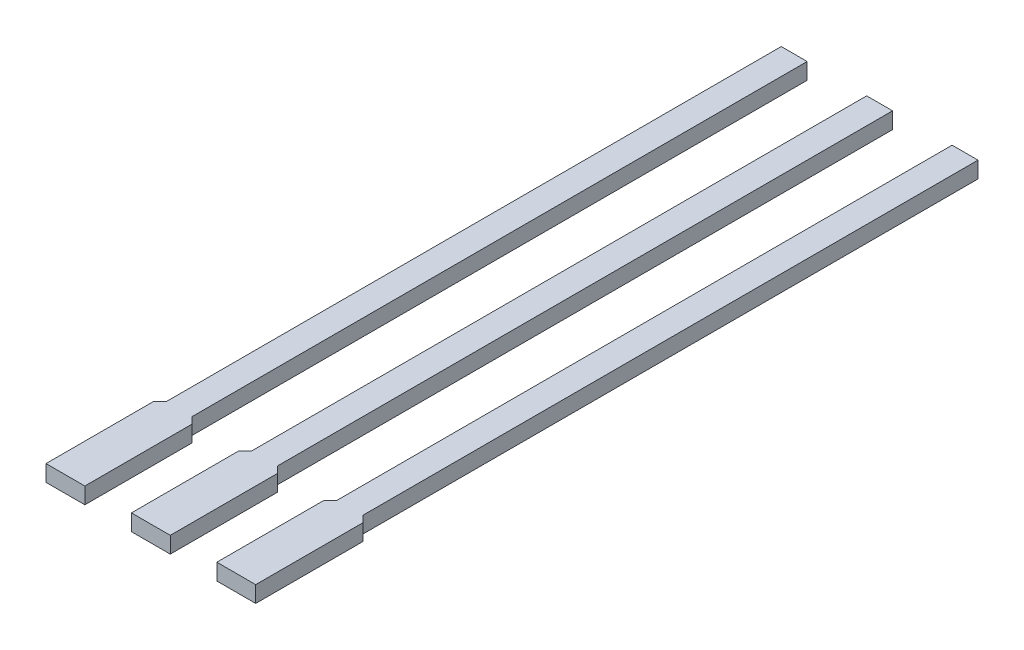
ISO-10303-21;
HEADER;
FILE_DESCRIPTION(('STEP AP214'),'2;1');
FILE_NAME('part.step','',(''),(''),'','','');
FILE_SCHEMA(('AUTOMOTIVE_DESIGN { 1 0 10303 214 1 1 1 1 }'));
ENDSEC;
DATA;
#1=APPLICATION_CONTEXT('core data for automotive mechanical design processes');
#2=APPLICATION_PROTOCOL_DEFINITION('international standard','automotive_design',2000,#1);
#3=PRODUCT_CONTEXT('',#1,'mechanical');
#4=PRODUCT('Part','Part','',(#3));
#5=PRODUCT_RELATED_PRODUCT_CATEGORY('part','',(#4));
#6=PRODUCT_DEFINITION_FORMATION('','',#4);
#7=PRODUCT_DEFINITION_CONTEXT('part definition',#1,'design');
#8=PRODUCT_DEFINITION('design','',#6,#7);
#9=PRODUCT_DEFINITION_SHAPE('','',#8);
#10=(LENGTH_UNIT() NAMED_UNIT(*) SI_UNIT(.MILLI.,.METRE.));
#11=(NAMED_UNIT(*) PLANE_ANGLE_UNIT() SI_UNIT($,.RADIAN.));
#12=(NAMED_UNIT(*) SI_UNIT($,.STERADIAN.) SOLID_ANGLE_UNIT());
#13=UNCERTAINTY_MEASURE_WITH_UNIT(LENGTH_MEASURE(1.E-05),#10,'distance_accuracy_value','');
#14=(GEOMETRIC_REPRESENTATION_CONTEXT(3) GLOBAL_UNCERTAINTY_ASSIGNED_CONTEXT((#13)) GLOBAL_UNIT_ASSIGNED_CONTEXT((#10,
#11,#12)) REPRESENTATION_CONTEXT('',''));
#15=CARTESIAN_POINT('',(0.,0.,0.));
#16=DIRECTION('',(0.,0.,1.));
#17=DIRECTION('',(1.,0.,0.));
#18=AXIS2_PLACEMENT_3D('',#15,#16,#17);
#19=CARTESIAN_POINT('',(0.,-0.2425,-7.336656531165));
#20=DIRECTION('',(0.,-1.,0.));
#21=DIRECTION('',(-1.,0.,0.));
#22=AXIS2_PLACEMENT_3D('',#19,#20,#21);
#23=PLANE('',#22);
#24=DIRECTION('',(1.,0.,0.));
#25=VECTOR('',#24,1.);
#26=CARTESIAN_POINT('',(-0.385,-0.2425,-18.29));
#27=LINE('',#26,#25);
#28=CARTESIAN_POINT('',(-0.385,-0.2425,-18.29));
#29=VERTEX_POINT('',#28);
#30=CARTESIAN_POINT('',(0.385,-0.2425,-18.29));
#31=VERTEX_POINT('',#30);
#32=EDGE_CURVE('P0_E137',#29,#31,#27,.T.);
#33=ORIENTED_EDGE('',*,*,#32,.T.);
#34=DIRECTION('',(0.,0.,1.));
#35=VECTOR('',#34,1.);
#36=CARTESIAN_POINT('',(0.385,-0.2425,-18.29));
#37=LINE('',#36,#35);
#38=CARTESIAN_POINT('',(0.385,-0.2425,0.));
#39=VERTEX_POINT('',#38);
#40=EDGE_CURVE('P0_E157',#31,#39,#37,.T.);
#41=ORIENTED_EDGE('',*,*,#40,.T.);
#42=DIRECTION('',(-0.707106781186548,0.,-0.707106781186548));
#43=VECTOR('',#42,1.);
#44=CARTESIAN_POINT('',(0.1925,-0.2425,-0.1925));
#45=LINE('',#44,#43);
#46=CARTESIAN_POINT('',(0.5775,-0.2425,0.1925));
#47=VERTEX_POINT('',#46);
#48=EDGE_CURVE('P0_E113',#47,#39,#45,.T.);
#49=ORIENTED_EDGE('',*,*,#48,.F.);
#50=DIRECTION('',(0.,0.,1.));
#51=VECTOR('',#50,1.);
#52=CARTESIAN_POINT('',(0.5775,-0.2425,0.));
#53=LINE('',#52,#51);
#54=CARTESIAN_POINT('',(0.5775,-0.2425,3.38));
#55=VERTEX_POINT('',#54);
#56=EDGE_CURVE('P0_E105',#47,#55,#53,.T.);
#57=ORIENTED_EDGE('',*,*,#56,.T.);
#58=DIRECTION('',(1.,0.,0.));
#59=VECTOR('',#58,1.);
#60=CARTESIAN_POINT('',(-0.5775,-0.2425,3.38));
#61=LINE('',#60,#59);
#62=CARTESIAN_POINT('',(-0.5775,-0.2425,3.38));
#63=VERTEX_POINT('',#62);
#64=EDGE_CURVE('P0_E27',#63,#55,#61,.T.);
#65=ORIENTED_EDGE('',*,*,#64,.F.);
#66=DIRECTION('',(0.,0.,1.));
#67=VECTOR('',#66,1.);
#68=CARTESIAN_POINT('',(-0.5775,-0.2425,0.));
#69=LINE('',#68,#67);
#70=CARTESIAN_POINT('',(-0.5775,-0.2425,0.1925));
#71=VERTEX_POINT('',#70);
#72=EDGE_CURVE('P0_E175',#71,#63,#69,.T.);
#73=ORIENTED_EDGE('',*,*,#72,.F.);
#74=DIRECTION('',(0.707106781186548,0.,-0.707106781186548));
#75=VECTOR('',#74,1.);
#76=CARTESIAN_POINT('',(-0.48125,-0.2425,0.09625));
#77=LINE('',#76,#75);
#78=CARTESIAN_POINT('',(-0.385,-0.2425,0.));
#79=VERTEX_POINT('',#78);
#80=EDGE_CURVE('P0_E127',#71,#79,#77,.T.);
#81=ORIENTED_EDGE('',*,*,#80,.T.);
#82=DIRECTION('',(0.,0.,1.));
#83=VECTOR('',#82,1.);
#84=CARTESIAN_POINT('',(-0.385,-0.2425,-18.29));
#85=LINE('',#84,#83);
#86=EDGE_CURVE('P0_E146',#29,#79,#85,.T.);
#87=ORIENTED_EDGE('',*,*,#86,.F.);
#88=EDGE_LOOP('',(#33,#41,#49,#57,#65,#73,#81,#87));
#89=FACE_BOUND('',#88,.T.);
#90=ADVANCED_FACE('P0_F16',(#89),#23,.T.);
#91=CARTESIAN_POINT('',(0.,0.2425,-7.336656531165));
#92=DIRECTION('',(0.,1.,0.));
#93=DIRECTION('',(0.,0.,-1.));
#94=AXIS2_PLACEMENT_3D('',#91,#92,#93);
#95=PLANE('',#94);
#96=DIRECTION('',(1.,0.,0.));
#97=VECTOR('',#96,1.);
#98=CARTESIAN_POINT('',(-0.385,0.2425,-18.29));
#99=LINE('',#98,#97);
#100=CARTESIAN_POINT('',(-0.385,0.2425,-18.29));
#101=VERTEX_POINT('',#100);
#102=CARTESIAN_POINT('',(0.385,0.2425,-18.29));
#103=VERTEX_POINT('',#102);
#104=EDGE_CURVE('P0_E129',#101,#103,#99,.T.);
#105=ORIENTED_EDGE('',*,*,#104,.F.);
#106=DIRECTION('',(0.,0.,1.));
#107=VECTOR('',#106,1.);
#108=CARTESIAN_POINT('',(-0.385,0.2425,-18.29));
#109=LINE('',#108,#107);
#110=CARTESIAN_POINT('',(-0.385,0.2425,0.));
#111=VERTEX_POINT('',#110);
#112=EDGE_CURVE('P0_E142',#101,#111,#109,.T.);
#113=ORIENTED_EDGE('',*,*,#112,.T.);
#114=DIRECTION('',(0.707106781186548,0.,-0.707106781186548));
#115=VECTOR('',#114,1.);
#116=CARTESIAN_POINT('',(-0.48125,0.2425,0.09625));
#117=LINE('',#116,#115);
#118=CARTESIAN_POINT('',(-0.5775,0.2425,0.1925));
#119=VERTEX_POINT('',#118);
#120=EDGE_CURVE('P0_E118',#119,#111,#117,.T.);
#121=ORIENTED_EDGE('',*,*,#120,.F.);
#122=DIRECTION('',(0.,0.,1.));
#123=VECTOR('',#122,1.);
#124=CARTESIAN_POINT('',(-0.5775,0.2425,0.));
#125=LINE('',#124,#123);
#126=CARTESIAN_POINT('',(-0.5775,0.2425,3.38));
#127=VERTEX_POINT('',#126);
#128=EDGE_CURVE('P0_E161',#119,#127,#125,.T.);
#129=ORIENTED_EDGE('',*,*,#128,.T.);
#130=DIRECTION('',(1.,0.,0.));
#131=VECTOR('',#130,1.);
#132=CARTESIAN_POINT('',(-0.5775,0.2425,3.38));
#133=LINE('',#132,#131);
#134=CARTESIAN_POINT('',(0.5775,0.2425,3.38));
#135=VERTEX_POINT('',#134);
#136=EDGE_CURVE('P0_E11',#127,#135,#133,.T.);
#137=ORIENTED_EDGE('',*,*,#136,.T.);
#138=DIRECTION('',(0.,0.,1.));
#139=VECTOR('',#138,1.);
#140=CARTESIAN_POINT('',(0.5775,0.2425,0.));
#141=LINE('',#140,#139);
#142=CARTESIAN_POINT('',(0.5775,0.2425,0.1925));
#143=VERTEX_POINT('',#142);
#144=EDGE_CURVE('P0_E94',#143,#135,#141,.T.);
#145=ORIENTED_EDGE('',*,*,#144,.F.);
#146=DIRECTION('',(-0.707106781186548,0.,-0.707106781186548));
#147=VECTOR('',#146,1.);
#148=CARTESIAN_POINT('',(0.1925,0.2425,-0.1925));
#149=LINE('',#148,#147);
#150=CARTESIAN_POINT('',(0.385,0.2425,0.));
#151=VERTEX_POINT('',#150);
#152=EDGE_CURVE('P0_E99',#143,#151,#149,.T.);
#153=ORIENTED_EDGE('',*,*,#152,.T.);
#154=DIRECTION('',(0.,0.,1.));
#155=VECTOR('',#154,1.);
#156=CARTESIAN_POINT('',(0.385,0.2425,-18.29));
#157=LINE('',#156,#155);
#158=EDGE_CURVE('P0_E128',#103,#151,#157,.T.);
#159=ORIENTED_EDGE('',*,*,#158,.F.);
#160=EDGE_LOOP('',(#105,#113,#121,#129,#137,#145,#153,#159));
#161=FACE_BOUND('',#160,.T.);
#162=ADVANCED_FACE('P0_F97',(#161),#95,.T.);
#163=CARTESIAN_POINT('',(-0.5775,-0.2425,3.38));
#164=DIRECTION('',(0.,0.,1.));
#165=DIRECTION('',(1.,0.,0.));
#166=AXIS2_PLACEMENT_3D('',#163,#164,#165);
#167=PLANE('',#166);
#168=DIRECTION('',(0.,1.,0.));
#169=VECTOR('',#168,1.);
#170=CARTESIAN_POINT('',(-0.5775,-0.2425,3.38));
#171=LINE('',#170,#169);
#172=EDGE_CURVE('P0_E158',#63,#127,#171,.T.);
#173=ORIENTED_EDGE('',*,*,#172,.F.);
#174=ORIENTED_EDGE('',*,*,#64,.T.);
#175=DIRECTION('',(0.,1.,0.));
#176=VECTOR('',#175,1.);
#177=CARTESIAN_POINT('',(0.5775,-0.2425,3.38));
#178=LINE('',#177,#176);
#179=EDGE_CURVE('P0_E104',#55,#135,#178,.T.);
#180=ORIENTED_EDGE('',*,*,#179,.T.);
#181=ORIENTED_EDGE('',*,*,#136,.F.);
#182=EDGE_LOOP('',(#173,#174,#180,#181));
#183=FACE_BOUND('',#182,.T.);
#184=ADVANCED_FACE('P0_F260',(#183),#167,.T.);
#185=CARTESIAN_POINT('',(0.5775,-0.2425,0.));
#186=DIRECTION('',(1.,0.,0.));
#187=DIRECTION('',(0.,1.,0.));
#188=AXIS2_PLACEMENT_3D('',#185,#186,#187);
#189=PLANE('',#188);
#190=ORIENTED_EDGE('',*,*,#56,.F.);
#191=DIRECTION('',(0.,1.,0.));
#192=VECTOR('',#191,1.);
#193=CARTESIAN_POINT('',(0.5775,-0.2425,0.1925));
#194=LINE('',#193,#192);
#195=EDGE_CURVE('P0_E20',#47,#143,#194,.T.);
#196=ORIENTED_EDGE('',*,*,#195,.T.);
#197=ORIENTED_EDGE('',*,*,#144,.T.);
#198=ORIENTED_EDGE('',*,*,#179,.F.);
#199=EDGE_LOOP('',(#190,#196,#197,#198));
#200=FACE_BOUND('',#199,.T.);
#201=ADVANCED_FACE('P0_F108',(#200),#189,.T.);
#202=CARTESIAN_POINT('',(-0.5775,-0.2425,0.));
#203=DIRECTION('',(1.,0.,0.));
#204=DIRECTION('',(0.,1.,0.));
#205=AXIS2_PLACEMENT_3D('',#202,#203,#204);
#206=PLANE('',#205);
#207=ORIENTED_EDGE('',*,*,#172,.T.);
#208=ORIENTED_EDGE('',*,*,#128,.F.);
#209=DIRECTION('',(0.,1.,0.));
#210=VECTOR('',#209,1.);
#211=CARTESIAN_POINT('',(-0.5775,-0.2425,0.1925));
#212=LINE('',#211,#210);
#213=EDGE_CURVE('P0_E123',#71,#119,#212,.T.);
#214=ORIENTED_EDGE('',*,*,#213,.F.);
#215=ORIENTED_EDGE('',*,*,#72,.T.);
#216=EDGE_LOOP('',(#207,#208,#214,#215));
#217=FACE_BOUND('',#216,.T.);
#218=ADVANCED_FACE('P0_F262',(#217),#206,.F.);
#219=CARTESIAN_POINT('',(0.48125,-0.2425,0.09625));
#220=DIRECTION('',(-0.707106781186548,0.,0.707106781186548));
#221=DIRECTION('',(0.,1.,0.));
#222=AXIS2_PLACEMENT_3D('',#219,#220,#221);
#223=PLANE('',#222);
#224=DIRECTION('',(0.,1.,0.));
#225=VECTOR('',#224,1.);
#226=CARTESIAN_POINT('',(0.385,-0.2425,0.));
#227=LINE('',#226,#225);
#228=EDGE_CURVE('P0_E115',#39,#151,#227,.T.);
#229=ORIENTED_EDGE('',*,*,#228,.T.);
#230=ORIENTED_EDGE('',*,*,#152,.F.);
#231=ORIENTED_EDGE('',*,*,#195,.F.);
#232=ORIENTED_EDGE('',*,*,#48,.T.);
#233=EDGE_LOOP('',(#229,#230,#231,#232));
#234=FACE_BOUND('',#233,.T.);
#235=ADVANCED_FACE('P0_F18',(#234),#223,.F.);
#236=CARTESIAN_POINT('',(-0.48125,-0.2425,0.09625));
#237=DIRECTION('',(-0.707106781186548,0.,-0.707106781186548));
#238=DIRECTION('',(-0.707106781186548,0.,0.707106781186548));
#239=AXIS2_PLACEMENT_3D('',#236,#237,#238);
#240=PLANE('',#239);
#241=ORIENTED_EDGE('',*,*,#80,.F.);
#242=ORIENTED_EDGE('',*,*,#213,.T.);
#243=ORIENTED_EDGE('',*,*,#120,.T.);
#244=DIRECTION('',(0.,1.,0.));
#245=VECTOR('',#244,1.);
#246=CARTESIAN_POINT('',(-0.385,-0.2425,0.));
#247=LINE('',#246,#245);
#248=EDGE_CURVE('P0_E147',#79,#111,#247,.T.);
#249=ORIENTED_EDGE('',*,*,#248,.F.);
#250=EDGE_LOOP('',(#241,#242,#243,#249));
#251=FACE_BOUND('',#250,.T.);
#252=ADVANCED_FACE('P0_F196',(#251),#240,.T.);
#253=CARTESIAN_POINT('',(0.385,-0.2425,-18.29));
#254=DIRECTION('',(1.,0.,0.));
#255=DIRECTION('',(0.,1.,0.));
#256=AXIS2_PLACEMENT_3D('',#253,#254,#255);
#257=PLANE('',#256);
#258=ORIENTED_EDGE('',*,*,#40,.F.);
#259=DIRECTION('',(0.,1.,0.));
#260=VECTOR('',#259,1.);
#261=CARTESIAN_POINT('',(0.385,-0.2425,-18.29));
#262=LINE('',#261,#260);
#263=EDGE_CURVE('P0_E133',#31,#103,#262,.T.);
#264=ORIENTED_EDGE('',*,*,#263,.T.);
#265=ORIENTED_EDGE('',*,*,#158,.T.);
#266=ORIENTED_EDGE('',*,*,#228,.F.);
#267=EDGE_LOOP('',(#258,#264,#265,#266));
#268=FACE_BOUND('',#267,.T.);
#269=ADVANCED_FACE('P0_F202',(#268),#257,.T.);
#270=CARTESIAN_POINT('',(-0.385,-0.2425,-18.29));
#271=DIRECTION('',(1.,0.,0.));
#272=DIRECTION('',(0.,1.,0.));
#273=AXIS2_PLACEMENT_3D('',#270,#271,#272);
#274=PLANE('',#273);
#275=ORIENTED_EDGE('',*,*,#248,.T.);
#276=ORIENTED_EDGE('',*,*,#112,.F.);
#277=DIRECTION('',(0.,1.,0.));
#278=VECTOR('',#277,1.);
#279=CARTESIAN_POINT('',(-0.385,-0.2425,-18.29));
#280=LINE('',#279,#278);
#281=EDGE_CURVE('P0_E141',#29,#101,#280,.T.);
#282=ORIENTED_EDGE('',*,*,#281,.F.);
#283=ORIENTED_EDGE('',*,*,#86,.T.);
#284=EDGE_LOOP('',(#275,#276,#282,#283));
#285=FACE_BOUND('',#284,.T.);
#286=ADVANCED_FACE('P0_F193',(#285),#274,.F.);
#287=CARTESIAN_POINT('',(-0.385,-0.2425,-18.29));
#288=DIRECTION('',(0.,0.,1.));
#289=DIRECTION('',(1.,0.,0.));
#290=AXIS2_PLACEMENT_3D('',#287,#288,#289);
#291=PLANE('',#290);
#292=ORIENTED_EDGE('',*,*,#104,.T.);
#293=ORIENTED_EDGE('',*,*,#263,.F.);
#294=ORIENTED_EDGE('',*,*,#32,.F.);
#295=ORIENTED_EDGE('',*,*,#281,.T.);
#296=EDGE_LOOP('',(#292,#293,#294,#295));
#297=FACE_BOUND('',#296,.T.);
#298=ADVANCED_FACE('P0_F199',(#297),#291,.F.);
#299=CLOSED_SHELL('',(#90,#162,#184,#201,#218,#235,#252,#269,#286,#298));
#300=MANIFOLD_SOLID_BREP('P0_B1',#299);
#301=CARTESIAN_POINT('',(2.54,-0.2425,-7.336656531165));
#302=DIRECTION('',(0.,-1.,0.));
#303=DIRECTION('',(-1.,0.,0.));
#304=AXIS2_PLACEMENT_3D('',#301,#302,#303);
#305=PLANE('',#304);
#306=DIRECTION('',(1.,0.,0.));
#307=VECTOR('',#306,1.);
#308=CARTESIAN_POINT('',(2.155,-0.2425,-18.29));
#309=LINE('',#308,#307);
#310=CARTESIAN_POINT('',(2.155,-0.2425,-18.29));
#311=VERTEX_POINT('',#310);
#312=CARTESIAN_POINT('',(2.925,-0.2425,-18.29));
#313=VERTEX_POINT('',#312);
#314=EDGE_CURVE('P1_E20',#311,#313,#309,.T.);
#315=ORIENTED_EDGE('',*,*,#314,.T.);
#316=DIRECTION('',(0.,0.,1.));
#317=VECTOR('',#316,1.);
#318=CARTESIAN_POINT('',(2.925,-0.2425,-18.29));
#319=LINE('',#318,#317);
#320=CARTESIAN_POINT('',(2.925,-0.2425,0.));
#321=VERTEX_POINT('',#320);
#322=EDGE_CURVE('P1_E178',#313,#321,#319,.T.);
#323=ORIENTED_EDGE('',*,*,#322,.T.);
#324=DIRECTION('',(-0.707106781186548,0.,-0.707106781186548));
#325=VECTOR('',#324,1.);
#326=CARTESIAN_POINT('',(2.7325,-0.2425,-0.1925));
#327=LINE('',#326,#325);
#328=CARTESIAN_POINT('',(3.1175,-0.2425,0.1925));
#329=VERTEX_POINT('',#328);
#330=EDGE_CURVE('P1_E168',#329,#321,#327,.T.);
#331=ORIENTED_EDGE('',*,*,#330,.F.);
#332=DIRECTION('',(0.,0.,1.));
#333=VECTOR('',#332,1.);
#334=CARTESIAN_POINT('',(3.1175,-0.2425,0.));
#335=LINE('',#334,#333);
#336=CARTESIAN_POINT('',(3.1175,-0.2425,3.38));
#337=VERTEX_POINT('',#336);
#338=EDGE_CURVE('P1_E56',#329,#337,#335,.T.);
#339=ORIENTED_EDGE('',*,*,#338,.T.);
#340=DIRECTION('',(1.,0.,0.));
#341=VECTOR('',#340,1.);
#342=CARTESIAN_POINT('',(1.9625,-0.2425,3.38));
#343=LINE('',#342,#341);
#344=CARTESIAN_POINT('',(1.9625,-0.2425,3.38));
#345=VERTEX_POINT('',#344);
#346=EDGE_CURVE('P1_E27',#345,#337,#343,.T.);
#347=ORIENTED_EDGE('',*,*,#346,.F.);
#348=DIRECTION('',(0.,0.,1.));
#349=VECTOR('',#348,1.);
#350=CARTESIAN_POINT('',(1.9625,-0.2425,0.));
#351=LINE('',#350,#349);
#352=CARTESIAN_POINT('',(1.9625,-0.2425,0.1925));
#353=VERTEX_POINT('',#352);
#354=EDGE_CURVE('P1_E161',#353,#345,#351,.T.);
#355=ORIENTED_EDGE('',*,*,#354,.F.);
#356=DIRECTION('',(0.707106781186548,0.,-0.707106781186548));
#357=VECTOR('',#356,1.);
#358=CARTESIAN_POINT('',(2.05875,-0.2425,0.09625));
#359=LINE('',#358,#357);
#360=CARTESIAN_POINT('',(2.155,-0.2425,0.));
#361=VERTEX_POINT('',#360);
#362=EDGE_CURVE('P1_E113',#353,#361,#359,.T.);
#363=ORIENTED_EDGE('',*,*,#362,.T.);
#364=DIRECTION('',(0.,0.,1.));
#365=VECTOR('',#364,1.);
#366=CARTESIAN_POINT('',(2.155,-0.2425,-18.29));
#367=LINE('',#366,#365);
#368=EDGE_CURVE('P1_E132',#311,#361,#367,.T.);
#369=ORIENTED_EDGE('',*,*,#368,.F.);
#370=EDGE_LOOP('',(#315,#323,#331,#339,#347,#355,#363,#369));
#371=FACE_BOUND('',#370,.T.);
#372=ADVANCED_FACE('P1_F16',(#371),#305,.T.);
#373=CARTESIAN_POINT('',(2.54,0.2425,-7.336656531165));
#374=DIRECTION('',(0.,1.,0.));
#375=DIRECTION('',(0.,0.,-1.));
#376=AXIS2_PLACEMENT_3D('',#373,#374,#375);
#377=PLANE('',#376);
#378=DIRECTION('',(1.,0.,0.));
#379=VECTOR('',#378,1.);
#380=CARTESIAN_POINT('',(2.155,0.2425,-18.29));
#381=LINE('',#380,#379);
#382=CARTESIAN_POINT('',(2.155,0.2425,-18.29));
#383=VERTEX_POINT('',#382);
#384=CARTESIAN_POINT('',(2.925,0.2425,-18.29));
#385=VERTEX_POINT('',#384);
#386=EDGE_CURVE('P1_E138',#383,#385,#381,.T.);
#387=ORIENTED_EDGE('',*,*,#386,.F.);
#388=DIRECTION('',(0.,0.,1.));
#389=VECTOR('',#388,1.);
#390=CARTESIAN_POINT('',(2.155,0.2425,-18.29));
#391=LINE('',#390,#389);
#392=CARTESIAN_POINT('',(2.155,0.2425,0.));
#393=VERTEX_POINT('',#392);
#394=EDGE_CURVE('P1_E125',#383,#393,#391,.T.);
#395=ORIENTED_EDGE('',*,*,#394,.T.);
#396=DIRECTION('',(0.707106781186548,0.,-0.707106781186548));
#397=VECTOR('',#396,1.);
#398=CARTESIAN_POINT('',(2.05875,0.2425,0.09625));
#399=LINE('',#398,#397);
#400=CARTESIAN_POINT('',(1.9625,0.2425,0.1925));
#401=VERTEX_POINT('',#400);
#402=EDGE_CURVE('P1_E101',#401,#393,#399,.T.);
#403=ORIENTED_EDGE('',*,*,#402,.F.);
#404=DIRECTION('',(0.,0.,1.));
#405=VECTOR('',#404,1.);
#406=CARTESIAN_POINT('',(1.9625,0.2425,0.));
#407=LINE('',#406,#405);
#408=CARTESIAN_POINT('',(1.9625,0.2425,3.38));
#409=VERTEX_POINT('',#408);
#410=EDGE_CURVE('P1_E78',#401,#409,#407,.T.);
#411=ORIENTED_EDGE('',*,*,#410,.T.);
#412=DIRECTION('',(1.,0.,0.));
#413=VECTOR('',#412,1.);
#414=CARTESIAN_POINT('',(1.9625,0.2425,3.38));
#415=LINE('',#414,#413);
#416=CARTESIAN_POINT('',(3.1175,0.2425,3.38));
#417=VERTEX_POINT('',#416);
#418=EDGE_CURVE('P1_E11',#409,#417,#415,.T.);
#419=ORIENTED_EDGE('',*,*,#418,.T.);
#420=DIRECTION('',(0.,0.,1.));
#421=VECTOR('',#420,1.);
#422=CARTESIAN_POINT('',(3.1175,0.2425,0.));
#423=LINE('',#422,#421);
#424=CARTESIAN_POINT('',(3.1175,0.2425,0.1925));
#425=VERTEX_POINT('',#424);
#426=EDGE_CURVE('P1_E67',#425,#417,#423,.T.);
#427=ORIENTED_EDGE('',*,*,#426,.F.);
#428=DIRECTION('',(-0.707106781186548,0.,-0.707106781186548));
#429=VECTOR('',#428,1.);
#430=CARTESIAN_POINT('',(2.7325,0.2425,-0.1925));
#431=LINE('',#430,#429);
#432=CARTESIAN_POINT('',(2.925,0.2425,0.));
#433=VERTEX_POINT('',#432);
#434=EDGE_CURVE('P1_E183',#425,#433,#431,.T.);
#435=ORIENTED_EDGE('',*,*,#434,.T.);
#436=DIRECTION('',(0.,0.,1.));
#437=VECTOR('',#436,1.);
#438=CARTESIAN_POINT('',(2.925,0.2425,-18.29));
#439=LINE('',#438,#437);
#440=EDGE_CURVE('P1_E144',#385,#433,#439,.T.);
#441=ORIENTED_EDGE('',*,*,#440,.F.);
#442=EDGE_LOOP('',(#387,#395,#403,#411,#419,#427,#435,#441));
#443=FACE_BOUND('',#442,.T.);
#444=ADVANCED_FACE('P1_F142',(#443),#377,.T.);
#445=CARTESIAN_POINT('',(1.9625,-0.2425,3.38));
#446=DIRECTION('',(0.,0.,1.));
#447=DIRECTION('',(1.,0.,0.));
#448=AXIS2_PLACEMENT_3D('',#445,#446,#447);
#449=PLANE('',#448);
#450=DIRECTION('',(0.,1.,0.));
#451=VECTOR('',#450,1.);
#452=CARTESIAN_POINT('',(1.9625,-0.2425,3.38));
#453=LINE('',#452,#451);
#454=EDGE_CURVE('P1_E162',#345,#409,#453,.T.);
#455=ORIENTED_EDGE('',*,*,#454,.F.);
#456=ORIENTED_EDGE('',*,*,#346,.T.);
#457=DIRECTION('',(0.,1.,0.));
#458=VECTOR('',#457,1.);
#459=CARTESIAN_POINT('',(3.1175,-0.2425,3.38));
#460=LINE('',#459,#458);
#461=EDGE_CURVE('P1_E155',#337,#417,#460,.T.);
#462=ORIENTED_EDGE('',*,*,#461,.T.);
#463=ORIENTED_EDGE('',*,*,#418,.F.);
#464=EDGE_LOOP('',(#455,#456,#462,#463));
#465=FACE_BOUND('',#464,.T.);
#466=ADVANCED_FACE('P1_F249',(#465),#449,.T.);
#467=CARTESIAN_POINT('',(3.1175,-0.2425,0.));
#468=DIRECTION('',(1.,0.,0.));
#469=DIRECTION('',(0.,1.,0.));
#470=AXIS2_PLACEMENT_3D('',#467,#468,#469);
#471=PLANE('',#470);
#472=ORIENTED_EDGE('',*,*,#338,.F.);
#473=DIRECTION('',(0.,1.,0.));
#474=VECTOR('',#473,1.);
#475=CARTESIAN_POINT('',(3.1175,-0.2425,0.1925));
#476=LINE('',#475,#474);
#477=EDGE_CURVE('P1_E174',#329,#425,#476,.T.);
#478=ORIENTED_EDGE('',*,*,#477,.T.);
#479=ORIENTED_EDGE('',*,*,#426,.T.);
#480=ORIENTED_EDGE('',*,*,#461,.F.);
#481=EDGE_LOOP('',(#472,#478,#479,#480));
#482=FACE_BOUND('',#481,.T.);
#483=ADVANCED_FACE('P1_F254',(#482),#471,.T.);
#484=CARTESIAN_POINT('',(1.9625,-0.2425,0.));
#485=DIRECTION('',(1.,0.,0.));
#486=DIRECTION('',(0.,1.,0.));
#487=AXIS2_PLACEMENT_3D('',#484,#485,#486);
#488=PLANE('',#487);
#489=ORIENTED_EDGE('',*,*,#454,.T.);
#490=ORIENTED_EDGE('',*,*,#410,.F.);
#491=DIRECTION('',(0.,1.,0.));
#492=VECTOR('',#491,1.);
#493=CARTESIAN_POINT('',(1.9625,-0.2425,0.1925));
#494=LINE('',#493,#492);
#495=EDGE_CURVE('P1_E158',#353,#401,#494,.T.);
#496=ORIENTED_EDGE('',*,*,#495,.F.);
#497=ORIENTED_EDGE('',*,*,#354,.T.);
#498=EDGE_LOOP('',(#489,#490,#496,#497));
#499=FACE_BOUND('',#498,.T.);
#500=ADVANCED_FACE('P1_F242',(#499),#488,.F.);
#501=CARTESIAN_POINT('',(3.02125,-0.2425,0.09625));
#502=DIRECTION('',(-0.707106781186548,0.,0.707106781186548));
#503=DIRECTION('',(0.,1.,0.));
#504=AXIS2_PLACEMENT_3D('',#501,#502,#503);
#505=PLANE('',#504);
#506=DIRECTION('',(0.,1.,0.));
#507=VECTOR('',#506,1.);
#508=CARTESIAN_POINT('',(2.925,-0.2425,0.));
#509=LINE('',#508,#507);
#510=EDGE_CURVE('P1_E159',#321,#433,#509,.T.);
#511=ORIENTED_EDGE('',*,*,#510,.T.);
#512=ORIENTED_EDGE('',*,*,#434,.F.);
#513=ORIENTED_EDGE('',*,*,#477,.F.);
#514=ORIENTED_EDGE('',*,*,#330,.T.);
#515=EDGE_LOOP('',(#511,#512,#513,#514));
#516=FACE_BOUND('',#515,.T.);
#517=ADVANCED_FACE('P1_F232',(#516),#505,.F.);
#518=CARTESIAN_POINT('',(2.05875,-0.2425,0.09625));
#519=DIRECTION('',(-0.707106781186548,0.,-0.707106781186548));
#520=DIRECTION('',(-0.707106781186548,0.,0.707106781186548));
#521=AXIS2_PLACEMENT_3D('',#518,#519,#520);
#522=PLANE('',#521);
#523=ORIENTED_EDGE('',*,*,#362,.F.);
#524=ORIENTED_EDGE('',*,*,#495,.T.);
#525=ORIENTED_EDGE('',*,*,#402,.T.);
#526=DIRECTION('',(0.,1.,0.));
#527=VECTOR('',#526,1.);
#528=CARTESIAN_POINT('',(2.155,-0.2425,0.));
#529=LINE('',#528,#527);
#530=EDGE_CURVE('P1_E129',#361,#393,#529,.T.);
#531=ORIENTED_EDGE('',*,*,#530,.F.);
#532=EDGE_LOOP('',(#523,#524,#525,#531));
#533=FACE_BOUND('',#532,.T.);
#534=ADVANCED_FACE('P1_F227',(#533),#522,.T.);
#535=CARTESIAN_POINT('',(2.925,-0.2425,-18.29));
#536=DIRECTION('',(1.,0.,0.));
#537=DIRECTION('',(0.,1.,0.));
#538=AXIS2_PLACEMENT_3D('',#535,#536,#537);
#539=PLANE('',#538);
#540=ORIENTED_EDGE('',*,*,#322,.F.);
#541=DIRECTION('',(0.,1.,0.));
#542=VECTOR('',#541,1.);
#543=CARTESIAN_POINT('',(2.925,-0.2425,-18.29));
#544=LINE('',#543,#542);
#545=EDGE_CURVE('P1_E147',#313,#385,#544,.T.);
#546=ORIENTED_EDGE('',*,*,#545,.T.);
#547=ORIENTED_EDGE('',*,*,#440,.T.);
#548=ORIENTED_EDGE('',*,*,#510,.F.);
#549=EDGE_LOOP('',(#540,#546,#547,#548));
#550=FACE_BOUND('',#549,.T.);
#551=ADVANCED_FACE('P1_F209',(#550),#539,.T.);
#552=CARTESIAN_POINT('',(2.155,-0.2425,-18.29));
#553=DIRECTION('',(1.,0.,0.));
#554=DIRECTION('',(0.,1.,0.));
#555=AXIS2_PLACEMENT_3D('',#552,#553,#554);
#556=PLANE('',#555);
#557=ORIENTED_EDGE('',*,*,#530,.T.);
#558=ORIENTED_EDGE('',*,*,#394,.F.);
#559=DIRECTION('',(0.,1.,0.));
#560=VECTOR('',#559,1.);
#561=CARTESIAN_POINT('',(2.155,-0.2425,-18.29));
#562=LINE('',#561,#560);
#563=EDGE_CURVE('P1_E127',#311,#383,#562,.T.);
#564=ORIENTED_EDGE('',*,*,#563,.F.);
#565=ORIENTED_EDGE('',*,*,#368,.T.);
#566=EDGE_LOOP('',(#557,#558,#564,#565));
#567=FACE_BOUND('',#566,.T.);
#568=ADVANCED_FACE('P1_F18',(#567),#556,.F.);
#569=CARTESIAN_POINT('',(2.155,-0.2425,-18.29));
#570=DIRECTION('',(0.,0.,1.));
#571=DIRECTION('',(1.,0.,0.));
#572=AXIS2_PLACEMENT_3D('',#569,#570,#571);
#573=PLANE('',#572);
#574=ORIENTED_EDGE('',*,*,#386,.T.);
#575=ORIENTED_EDGE('',*,*,#545,.F.);
#576=ORIENTED_EDGE('',*,*,#314,.F.);
#577=ORIENTED_EDGE('',*,*,#563,.T.);
#578=EDGE_LOOP('',(#574,#575,#576,#577));
#579=FACE_BOUND('',#578,.T.);
#580=ADVANCED_FACE('P1_F136',(#579),#573,.F.);
#581=CLOSED_SHELL('',(#372,#444,#466,#483,#500,#517,#534,#551,#568,#580));
#582=MANIFOLD_SOLID_BREP('P1_B1',#581);
#583=CARTESIAN_POINT('',(5.08,-0.2425,-7.336656531165));
#584=DIRECTION('',(0.,-1.,0.));
#585=DIRECTION('',(-1.,0.,0.));
#586=AXIS2_PLACEMENT_3D('',#583,#584,#585);
#587=PLANE('',#586);
#588=DIRECTION('',(1.,0.,0.));
#589=VECTOR('',#588,1.);
#590=CARTESIAN_POINT('',(4.695,-0.2425,-18.29));
#591=LINE('',#590,#589);
#592=CARTESIAN_POINT('',(4.695,-0.2425,-18.29));
#593=VERTEX_POINT('',#592);
#594=CARTESIAN_POINT('',(5.465,-0.2425,-18.29));
#595=VERTEX_POINT('',#594);
#596=EDGE_CURVE('P2_E151',#593,#595,#591,.T.);
#597=ORIENTED_EDGE('',*,*,#596,.T.);
#598=DIRECTION('',(0.,0.,1.));
#599=VECTOR('',#598,1.);
#600=CARTESIAN_POINT('',(5.465,-0.2425,-18.29));
#601=LINE('',#600,#599);
#602=CARTESIAN_POINT('',(5.465,-0.2425,0.));
#603=VERTEX_POINT('',#602);
#604=EDGE_CURVE('P2_E145',#595,#603,#601,.T.);
#605=ORIENTED_EDGE('',*,*,#604,.T.);
#606=DIRECTION('',(-0.707106781186548,0.,-0.707106781186548));
#607=VECTOR('',#606,1.);
#608=CARTESIAN_POINT('',(5.2725,-0.2425,-0.1925));
#609=LINE('',#608,#607);
#610=CARTESIAN_POINT('',(5.6575,-0.2425,0.1925));
#611=VERTEX_POINT('',#610);
#612=EDGE_CURVE('P2_E133',#611,#603,#609,.T.);
#613=ORIENTED_EDGE('',*,*,#612,.F.);
#614=DIRECTION('',(0.,0.,1.));
#615=VECTOR('',#614,1.);
#616=CARTESIAN_POINT('',(5.6575,-0.2425,0.));
#617=LINE('',#616,#615);
#618=CARTESIAN_POINT('',(5.6575,-0.2425,3.38));
#619=VERTEX_POINT('',#618);
#620=EDGE_CURVE('P2_E116',#611,#619,#617,.T.);
#621=ORIENTED_EDGE('',*,*,#620,.T.);
#622=DIRECTION('',(1.,0.,0.));
#623=VECTOR('',#622,1.);
#624=CARTESIAN_POINT('',(4.5025,-0.2425,3.38));
#625=LINE('',#624,#623);
#626=CARTESIAN_POINT('',(4.5025,-0.2425,3.38));
#627=VERTEX_POINT('',#626);
#628=EDGE_CURVE('P2_E27',#627,#619,#625,.T.);
#629=ORIENTED_EDGE('',*,*,#628,.F.);
#630=DIRECTION('',(0.,0.,1.));
#631=VECTOR('',#630,1.);
#632=CARTESIAN_POINT('',(4.5025,-0.2425,0.));
#633=LINE('',#632,#631);
#634=CARTESIAN_POINT('',(4.5025,-0.2425,0.1925));
#635=VERTEX_POINT('',#634);
#636=EDGE_CURVE('P2_E113',#635,#627,#633,.T.);
#637=ORIENTED_EDGE('',*,*,#636,.F.);
#638=DIRECTION('',(0.707106781186548,0.,-0.707106781186548));
#639=VECTOR('',#638,1.);
#640=CARTESIAN_POINT('',(4.59875,-0.2425,0.09625));
#641=LINE('',#640,#639);
#642=CARTESIAN_POINT('',(4.695,-0.2425,0.));
#643=VERTEX_POINT('',#642);
#644=EDGE_CURVE('P2_E99',#635,#643,#641,.T.);
#645=ORIENTED_EDGE('',*,*,#644,.T.);
#646=DIRECTION('',(0.,0.,1.));
#647=VECTOR('',#646,1.);
#648=CARTESIAN_POINT('',(4.695,-0.2425,-18.29));
#649=LINE('',#648,#647);
#650=EDGE_CURVE('P2_E104',#593,#643,#649,.T.);
#651=ORIENTED_EDGE('',*,*,#650,.F.);
#652=EDGE_LOOP('',(#597,#605,#613,#621,#629,#637,#645,#651));
#653=FACE_BOUND('',#652,.T.);
#654=ADVANCED_FACE('P2_F16',(#653),#587,.T.);
#655=CARTESIAN_POINT('',(5.08,0.2425,-7.336656531165));
#656=DIRECTION('',(0.,1.,0.));
#657=DIRECTION('',(0.,0.,-1.));
#658=AXIS2_PLACEMENT_3D('',#655,#656,#657);
#659=PLANE('',#658);
#660=DIRECTION('',(1.,0.,0.));
#661=VECTOR('',#660,1.);
#662=CARTESIAN_POINT('',(4.695,0.2425,-18.29));
#663=LINE('',#662,#661);
#664=CARTESIAN_POINT('',(4.695,0.2425,-18.29));
#665=VERTEX_POINT('',#664);
#666=CARTESIAN_POINT('',(5.465,0.2425,-18.29));
#667=VERTEX_POINT('',#666);
#668=EDGE_CURVE('P2_E156',#665,#667,#663,.T.);
#669=ORIENTED_EDGE('',*,*,#668,.F.);
#670=DIRECTION('',(0.,0.,1.));
#671=VECTOR('',#670,1.);
#672=CARTESIAN_POINT('',(4.695,0.2425,-18.29));
#673=LINE('',#672,#671);
#674=CARTESIAN_POINT('',(4.695,0.2425,0.));
#675=VERTEX_POINT('',#674);
#676=EDGE_CURVE('P2_E20',#665,#675,#673,.T.);
#677=ORIENTED_EDGE('',*,*,#676,.T.);
#678=DIRECTION('',(0.707106781186548,0.,-0.707106781186548));
#679=VECTOR('',#678,1.);
#680=CARTESIAN_POINT('',(4.59875,0.2425,0.09625));
#681=LINE('',#680,#679);
#682=CARTESIAN_POINT('',(4.5025,0.2425,0.1925));
#683=VERTEX_POINT('',#682);
#684=EDGE_CURVE('P2_E90',#683,#675,#681,.T.);
#685=ORIENTED_EDGE('',*,*,#684,.F.);
#686=DIRECTION('',(0.,0.,1.));
#687=VECTOR('',#686,1.);
#688=CARTESIAN_POINT('',(4.5025,0.2425,0.));
#689=LINE('',#688,#687);
#690=CARTESIAN_POINT('',(4.5025,0.2425,3.38));
#691=VERTEX_POINT('',#690);
#692=EDGE_CURVE('P2_E129',#683,#691,#689,.T.);
#693=ORIENTED_EDGE('',*,*,#692,.T.);
#694=DIRECTION('',(1.,0.,0.));
#695=VECTOR('',#694,1.);
#696=CARTESIAN_POINT('',(4.5025,0.2425,3.38));
#697=LINE('',#696,#695);
#698=CARTESIAN_POINT('',(5.6575,0.2425,3.38));
#699=VERTEX_POINT('',#698);
#700=EDGE_CURVE('P2_E11',#691,#699,#697,.T.);
#701=ORIENTED_EDGE('',*,*,#700,.T.);
#702=DIRECTION('',(0.,0.,1.));
#703=VECTOR('',#702,1.);
#704=CARTESIAN_POINT('',(5.6575,0.2425,0.));
#705=LINE('',#704,#703);
#706=CARTESIAN_POINT('',(5.6575,0.2425,0.1925));
#707=VERTEX_POINT('',#706);
#708=EDGE_CURVE('P2_E162',#707,#699,#705,.T.);
#709=ORIENTED_EDGE('',*,*,#708,.F.);
#710=DIRECTION('',(-0.707106781186548,0.,-0.707106781186548));
#711=VECTOR('',#710,1.);
#712=CARTESIAN_POINT('',(5.2725,0.2425,-0.1925));
#713=LINE('',#712,#711);
#714=CARTESIAN_POINT('',(5.465,0.2425,0.));
#715=VERTEX_POINT('',#714);
#716=EDGE_CURVE('P2_E177',#707,#715,#713,.T.);
#717=ORIENTED_EDGE('',*,*,#716,.T.);
#718=DIRECTION('',(0.,0.,1.));
#719=VECTOR('',#718,1.);
#720=CARTESIAN_POINT('',(5.465,0.2425,-18.29));
#721=LINE('',#720,#719);
#722=EDGE_CURVE('P2_E161',#667,#715,#721,.T.);
#723=ORIENTED_EDGE('',*,*,#722,.F.);
#724=EDGE_LOOP('',(#669,#677,#685,#693,#701,#709,#717,#723));
#725=FACE_BOUND('',#724,.T.);
#726=ADVANCED_FACE('P2_F176',(#725),#659,.T.);
#727=CARTESIAN_POINT('',(4.5025,-0.2425,3.38));
#728=DIRECTION('',(0.,0.,1.));
#729=DIRECTION('',(1.,0.,0.));
#730=AXIS2_PLACEMENT_3D('',#727,#728,#729);
#731=PLANE('',#730);
#732=DIRECTION('',(0.,1.,0.));
#733=VECTOR('',#732,1.);
#734=CARTESIAN_POINT('',(4.5025,-0.2425,3.38));
#735=LINE('',#734,#733);
#736=EDGE_CURVE('P2_E126',#627,#691,#735,.T.);
#737=ORIENTED_EDGE('',*,*,#736,.F.);
#738=ORIENTED_EDGE('',*,*,#628,.T.);
#739=DIRECTION('',(0.,1.,0.));
#740=VECTOR('',#739,1.);
#741=CARTESIAN_POINT('',(5.6575,-0.2425,3.38));
#742=LINE('',#741,#740);
#743=EDGE_CURVE('P2_E121',#619,#699,#742,.T.);
#744=ORIENTED_EDGE('',*,*,#743,.T.);
#745=ORIENTED_EDGE('',*,*,#700,.F.);
#746=EDGE_LOOP('',(#737,#738,#744,#745));
#747=FACE_BOUND('',#746,.T.);
#748=ADVANCED_FACE('P2_F131',(#747),#731,.T.);
#749=CARTESIAN_POINT('',(5.6575,-0.2425,0.));
#750=DIRECTION('',(1.,0.,0.));
#751=DIRECTION('',(0.,1.,0.));
#752=AXIS2_PLACEMENT_3D('',#749,#750,#751);
#753=PLANE('',#752);
#754=ORIENTED_EDGE('',*,*,#620,.F.);
#755=DIRECTION('',(0.,1.,0.));
#756=VECTOR('',#755,1.);
#757=CARTESIAN_POINT('',(5.6575,-0.2425,0.1925));
#758=LINE('',#757,#756);
#759=EDGE_CURVE('P2_E141',#611,#707,#758,.T.);
#760=ORIENTED_EDGE('',*,*,#759,.T.);
#761=ORIENTED_EDGE('',*,*,#708,.T.);
#762=ORIENTED_EDGE('',*,*,#743,.F.);
#763=EDGE_LOOP('',(#754,#760,#761,#762));
#764=FACE_BOUND('',#763,.T.);
#765=ADVANCED_FACE('P2_F172',(#764),#753,.T.);
#766=CARTESIAN_POINT('',(4.5025,-0.2425,0.));
#767=DIRECTION('',(1.,0.,0.));
#768=DIRECTION('',(0.,1.,0.));
#769=AXIS2_PLACEMENT_3D('',#766,#767,#768);
#770=PLANE('',#769);
#771=ORIENTED_EDGE('',*,*,#736,.T.);
#772=ORIENTED_EDGE('',*,*,#692,.F.);
#773=DIRECTION('',(0.,1.,0.));
#774=VECTOR('',#773,1.);
#775=CARTESIAN_POINT('',(4.5025,-0.2425,0.1925));
#776=LINE('',#775,#774);
#777=EDGE_CURVE('P2_E127',#635,#683,#776,.T.);
#778=ORIENTED_EDGE('',*,*,#777,.F.);
#779=ORIENTED_EDGE('',*,*,#636,.T.);
#780=EDGE_LOOP('',(#771,#772,#778,#779));
#781=FACE_BOUND('',#780,.T.);
#782=ADVANCED_FACE('P2_F125',(#781),#770,.F.);
#783=CARTESIAN_POINT('',(5.56125,-0.2425,0.09625));
#784=DIRECTION('',(-0.707106781186548,0.,0.707106781186548));
#785=DIRECTION('',(0.,1.,0.));
#786=AXIS2_PLACEMENT_3D('',#783,#784,#785);
#787=PLANE('',#786);
#788=DIRECTION('',(0.,1.,0.));
#789=VECTOR('',#788,1.);
#790=CARTESIAN_POINT('',(5.465,-0.2425,0.));
#791=LINE('',#790,#789);
#792=EDGE_CURVE('P2_E157',#603,#715,#791,.T.);
#793=ORIENTED_EDGE('',*,*,#792,.T.);
#794=ORIENTED_EDGE('',*,*,#716,.F.);
#795=ORIENTED_EDGE('',*,*,#759,.F.);
#796=ORIENTED_EDGE('',*,*,#612,.T.);
#797=EDGE_LOOP('',(#793,#794,#795,#796));
#798=FACE_BOUND('',#797,.T.);
#799=ADVANCED_FACE('P2_F183',(#798),#787,.F.);
#800=CARTESIAN_POINT('',(4.59875,-0.2425,0.09625));
#801=DIRECTION('',(-0.707106781186548,0.,-0.707106781186548));
#802=DIRECTION('',(-0.707106781186548,0.,0.707106781186548));
#803=AXIS2_PLACEMENT_3D('',#800,#801,#802);
#804=PLANE('',#803);
#805=ORIENTED_EDGE('',*,*,#644,.F.);
#806=ORIENTED_EDGE('',*,*,#777,.T.);
#807=ORIENTED_EDGE('',*,*,#684,.T.);
#808=DIRECTION('',(0.,1.,0.));
#809=VECTOR('',#808,1.);
#810=CARTESIAN_POINT('',(4.695,-0.2425,0.));
#811=LINE('',#810,#809);
#812=EDGE_CURVE('P2_E150',#643,#675,#811,.T.);
#813=ORIENTED_EDGE('',*,*,#812,.F.);
#814=EDGE_LOOP('',(#805,#806,#807,#813));
#815=FACE_BOUND('',#814,.T.);
#816=ADVANCED_FACE('P2_F229',(#815),#804,.T.);
#817=CARTESIAN_POINT('',(5.465,-0.2425,-18.29));
#818=DIRECTION('',(1.,0.,0.));
#819=DIRECTION('',(0.,1.,0.));
#820=AXIS2_PLACEMENT_3D('',#817,#818,#819);
#821=PLANE('',#820);
#822=ORIENTED_EDGE('',*,*,#604,.F.);
#823=DIRECTION('',(0.,1.,0.));
#824=VECTOR('',#823,1.);
#825=CARTESIAN_POINT('',(5.465,-0.2425,-18.29));
#826=LINE('',#825,#824);
#827=EDGE_CURVE('P2_E152',#595,#667,#826,.T.);
#828=ORIENTED_EDGE('',*,*,#827,.T.);
#829=ORIENTED_EDGE('',*,*,#722,.T.);
#830=ORIENTED_EDGE('',*,*,#792,.F.);
#831=EDGE_LOOP('',(#822,#828,#829,#830));
#832=FACE_BOUND('',#831,.T.);
#833=ADVANCED_FACE('P2_F186',(#832),#821,.T.);
#834=CARTESIAN_POINT('',(4.695,-0.2425,-18.29));
#835=DIRECTION('',(1.,0.,0.));
#836=DIRECTION('',(0.,1.,0.));
#837=AXIS2_PLACEMENT_3D('',#834,#835,#836);
#838=PLANE('',#837);
#839=ORIENTED_EDGE('',*,*,#812,.T.);
#840=ORIENTED_EDGE('',*,*,#676,.F.);
#841=DIRECTION('',(0.,1.,0.));
#842=VECTOR('',#841,1.);
#843=CARTESIAN_POINT('',(4.695,-0.2425,-18.29));
#844=LINE('',#843,#842);
#845=EDGE_CURVE('P2_E147',#593,#665,#844,.T.);
#846=ORIENTED_EDGE('',*,*,#845,.F.);
#847=ORIENTED_EDGE('',*,*,#650,.T.);
#848=EDGE_LOOP('',(#839,#840,#846,#847));
#849=FACE_BOUND('',#848,.T.);
#850=ADVANCED_FACE('P2_F228',(#849),#838,.F.);
#851=CARTESIAN_POINT('',(4.695,-0.2425,-18.29));
#852=DIRECTION('',(0.,0.,1.));
#853=DIRECTION('',(1.,0.,0.));
#854=AXIS2_PLACEMENT_3D('',#851,#852,#853);
#855=PLANE('',#854);
#856=ORIENTED_EDGE('',*,*,#668,.T.);
#857=ORIENTED_EDGE('',*,*,#827,.F.);
#858=ORIENTED_EDGE('',*,*,#596,.F.);
#859=ORIENTED_EDGE('',*,*,#845,.T.);
#860=EDGE_LOOP('',(#856,#857,#858,#859));
#861=FACE_BOUND('',#860,.T.);
#862=ADVANCED_FACE('P2_F18',(#861),#855,.F.);
#863=CLOSED_SHELL('',(#654,#726,#748,#765,#782,#799,#816,#833,#850,#862));
#864=MANIFOLD_SOLID_BREP('P2_B1',#863);
#865=ADVANCED_BREP_SHAPE_REPRESENTATION('',(#18,#300,#582,#864),#14);
#866=SHAPE_DEFINITION_REPRESENTATION(#9,#865);
ENDSEC;
END-ISO-10303-21;
